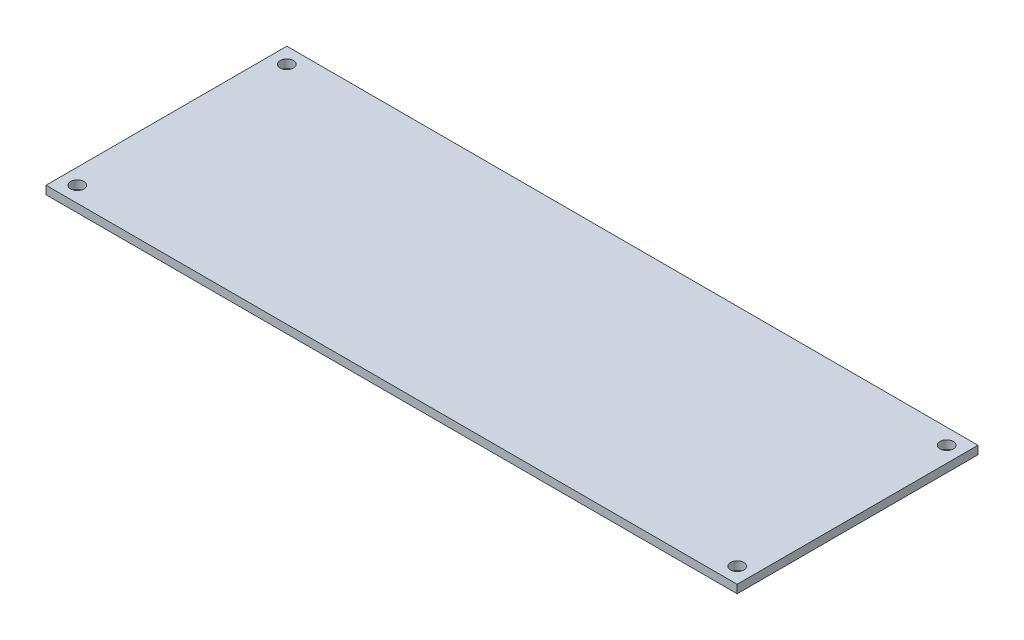
ISO-10303-21;
HEADER;
FILE_DESCRIPTION(('STEP AP214'),'2;1');
FILE_NAME('part.step','',(''),(''),'','','');
FILE_SCHEMA(('AUTOMOTIVE_DESIGN { 1 0 10303 214 1 1 1 1 }'));
ENDSEC;
DATA;
#1=APPLICATION_CONTEXT('core data for automotive mechanical design processes');
#2=APPLICATION_PROTOCOL_DEFINITION('international standard','automotive_design',2000,#1);
#3=PRODUCT_CONTEXT('',#1,'mechanical');
#4=PRODUCT('Part','Part','',(#3));
#5=PRODUCT_RELATED_PRODUCT_CATEGORY('part','',(#4));
#6=PRODUCT_DEFINITION_FORMATION('','',#4);
#7=PRODUCT_DEFINITION_CONTEXT('part definition',#1,'design');
#8=PRODUCT_DEFINITION('design','',#6,#7);
#9=PRODUCT_DEFINITION_SHAPE('','',#8);
#10=(LENGTH_UNIT() NAMED_UNIT(*) SI_UNIT(.MILLI.,.METRE.));
#11=(NAMED_UNIT(*) PLANE_ANGLE_UNIT() SI_UNIT($,.RADIAN.));
#12=(NAMED_UNIT(*) SI_UNIT($,.STERADIAN.) SOLID_ANGLE_UNIT());
#13=UNCERTAINTY_MEASURE_WITH_UNIT(LENGTH_MEASURE(1.E-05),#10,'distance_accuracy_value','');
#14=(GEOMETRIC_REPRESENTATION_CONTEXT(3) GLOBAL_UNCERTAINTY_ASSIGNED_CONTEXT((#13)) GLOBAL_UNIT_ASSIGNED_CONTEXT((#10,
#11,#12)) REPRESENTATION_CONTEXT('',''));
#15=CARTESIAN_POINT('',(0.,0.,0.));
#16=DIRECTION('',(0.,0.,1.));
#17=DIRECTION('',(1.,0.,0.));
#18=AXIS2_PLACEMENT_3D('',#15,#16,#17);
#19=CARTESIAN_POINT('',(-83.8,2.,-29.2));
#20=DIRECTION('',(1.,0.,0.));
#21=DIRECTION('',(0.,0.,-1.));
#22=AXIS2_PLACEMENT_3D('',#19,#20,#21);
#23=PLANE('',#22);
#24=DIRECTION('',(0.,0.,1.));
#25=VECTOR('',#24,1.);
#26=CARTESIAN_POINT('',(-83.8,0.,-29.2));
#27=LINE('',#26,#25);
#28=CARTESIAN_POINT('',(-83.8,0.,-29.2));
#29=VERTEX_POINT('',#28);
#30=CARTESIAN_POINT('',(-83.8,0.,29.2));
#31=VERTEX_POINT('',#30);
#32=EDGE_CURVE('E96',#29,#31,#27,.T.);
#33=ORIENTED_EDGE('',*,*,#32,.T.);
#34=DIRECTION('',(0.,-1.,0.));
#35=VECTOR('',#34,1.);
#36=CARTESIAN_POINT('',(-83.8,2.,29.2));
#37=LINE('',#36,#35);
#38=CARTESIAN_POINT('',(-83.8,2.,29.2));
#39=VERTEX_POINT('',#38);
#40=EDGE_CURVE('E11',#39,#31,#37,.T.);
#41=ORIENTED_EDGE('',*,*,#40,.F.);
#42=DIRECTION('',(0.,0.,1.));
#43=VECTOR('',#42,1.);
#44=CARTESIAN_POINT('',(-83.8,2.,-29.2));
#45=LINE('',#44,#43);
#46=CARTESIAN_POINT('',(-83.8,2.,-29.2));
#47=VERTEX_POINT('',#46);
#48=EDGE_CURVE('E82',#47,#39,#45,.T.);
#49=ORIENTED_EDGE('',*,*,#48,.F.);
#50=DIRECTION('',(0.,-1.,0.));
#51=VECTOR('',#50,1.);
#52=CARTESIAN_POINT('',(-83.8,2.,-29.2));
#53=LINE('',#52,#51);
#54=EDGE_CURVE('E49',#47,#29,#53,.T.);
#55=ORIENTED_EDGE('',*,*,#54,.T.);
#56=EDGE_LOOP('',(#33,#41,#49,#55));
#57=FACE_BOUND('',#56,.T.);
#58=ADVANCED_FACE('F33',(#57),#23,.F.);
#59=CARTESIAN_POINT('',(-83.8,2.,29.2));
#60=DIRECTION('',(0.,0.,-1.));
#61=DIRECTION('',(-1.,0.,0.));
#62=AXIS2_PLACEMENT_3D('',#59,#60,#61);
#63=PLANE('',#62);
#64=DIRECTION('',(1.,0.,0.));
#65=VECTOR('',#64,1.);
#66=CARTESIAN_POINT('',(-83.8,0.,29.2));
#67=LINE('',#66,#65);
#68=CARTESIAN_POINT('',(83.8,0.,29.2));
#69=VERTEX_POINT('',#68);
#70=EDGE_CURVE('E87',#31,#69,#67,.T.);
#71=ORIENTED_EDGE('',*,*,#70,.T.);
#72=DIRECTION('',(0.,-1.,0.));
#73=VECTOR('',#72,1.);
#74=CARTESIAN_POINT('',(83.8,2.,29.2));
#75=LINE('',#74,#73);
#76=CARTESIAN_POINT('',(83.8,2.,29.2));
#77=VERTEX_POINT('',#76);
#78=EDGE_CURVE('E41',#77,#69,#75,.T.);
#79=ORIENTED_EDGE('',*,*,#78,.F.);
#80=DIRECTION('',(1.,0.,0.));
#81=VECTOR('',#80,1.);
#82=CARTESIAN_POINT('',(-83.8,2.,29.2));
#83=LINE('',#82,#81);
#84=EDGE_CURVE('E74',#39,#77,#83,.T.);
#85=ORIENTED_EDGE('',*,*,#84,.F.);
#86=ORIENTED_EDGE('',*,*,#40,.T.);
#87=EDGE_LOOP('',(#71,#79,#85,#86));
#88=FACE_BOUND('',#87,.T.);
#89=ADVANCED_FACE('F86',(#88),#63,.F.);
#90=CARTESIAN_POINT('',(83.8,2.,-29.2));
#91=DIRECTION('',(1.,0.,0.));
#92=DIRECTION('',(0.,0.,-1.));
#93=AXIS2_PLACEMENT_3D('',#90,#91,#92);
#94=PLANE('',#93);
#95=DIRECTION('',(0.,0.,1.));
#96=VECTOR('',#95,1.);
#97=CARTESIAN_POINT('',(83.8,0.,-29.2));
#98=LINE('',#97,#96);
#99=CARTESIAN_POINT('',(83.8,0.,-29.2));
#100=VERTEX_POINT('',#99);
#101=EDGE_CURVE('E100',#100,#69,#98,.T.);
#102=ORIENTED_EDGE('',*,*,#101,.F.);
#103=DIRECTION('',(0.,-1.,0.));
#104=VECTOR('',#103,1.);
#105=CARTESIAN_POINT('',(83.8,2.,-29.2));
#106=LINE('',#105,#104);
#107=CARTESIAN_POINT('',(83.8,2.,-29.2));
#108=VERTEX_POINT('',#107);
#109=EDGE_CURVE('E63',#108,#100,#106,.T.);
#110=ORIENTED_EDGE('',*,*,#109,.F.);
#111=DIRECTION('',(0.,0.,1.));
#112=VECTOR('',#111,1.);
#113=CARTESIAN_POINT('',(83.8,2.,-29.2));
#114=LINE('',#113,#112);
#115=EDGE_CURVE('E81',#108,#77,#114,.T.);
#116=ORIENTED_EDGE('',*,*,#115,.T.);
#117=ORIENTED_EDGE('',*,*,#78,.T.);
#118=EDGE_LOOP('',(#102,#110,#116,#117));
#119=FACE_BOUND('',#118,.T.);
#120=ADVANCED_FACE('F90',(#119),#94,.T.);
#121=CARTESIAN_POINT('',(-83.8,2.,-29.2));
#122=DIRECTION('',(0.,0.,-1.));
#123=DIRECTION('',(-1.,0.,0.));
#124=AXIS2_PLACEMENT_3D('',#121,#122,#123);
#125=PLANE('',#124);
#126=DIRECTION('',(1.,0.,0.));
#127=VECTOR('',#126,1.);
#128=CARTESIAN_POINT('',(-83.8,0.,-29.2));
#129=LINE('',#128,#127);
#130=EDGE_CURVE('E102',#29,#100,#129,.T.);
#131=ORIENTED_EDGE('',*,*,#130,.F.);
#132=ORIENTED_EDGE('',*,*,#54,.F.);
#133=DIRECTION('',(1.,0.,0.));
#134=VECTOR('',#133,1.);
#135=CARTESIAN_POINT('',(-83.8,2.,-29.2));
#136=LINE('',#135,#134);
#137=EDGE_CURVE('E91',#47,#108,#136,.T.);
#138=ORIENTED_EDGE('',*,*,#137,.T.);
#139=ORIENTED_EDGE('',*,*,#109,.T.);
#140=EDGE_LOOP('',(#131,#132,#138,#139));
#141=FACE_BOUND('',#140,.T.);
#142=ADVANCED_FACE('F138',(#141),#125,.T.);
#143=CARTESIAN_POINT('',(0.,2.,0.));
#144=DIRECTION('',(0.,1.,0.));
#145=DIRECTION('',(0.,0.,1.));
#146=AXIS2_PLACEMENT_3D('',#143,#144,#145);
#147=PLANE('',#146);
#148=CARTESIAN_POINT('',(-80.,2.,25.4));
#149=DIRECTION('',(0.,1.,0.));
#150=DIRECTION('',(0.,0.,1.));
#151=AXIS2_PLACEMENT_3D('',#148,#149,#150);
#152=CIRCLE('',#151,1.6);
#153=CARTESIAN_POINT('',(-80.,2.,27.));
#154=VERTEX_POINT('',#153);
#155=EDGE_CURVE('E111',#154,#154,#152,.T.);
#156=ORIENTED_EDGE('',*,*,#155,.F.);
#157=EDGE_LOOP('',(#156));
#158=FACE_BOUND('',#157,.T.);
#159=CARTESIAN_POINT('',(80.,2.,-25.4));
#160=DIRECTION('',(0.,1.,0.));
#161=DIRECTION('',(0.,0.,1.));
#162=AXIS2_PLACEMENT_3D('',#159,#160,#161);
#163=CIRCLE('',#162,1.6);
#164=CARTESIAN_POINT('',(80.,2.,-23.8));
#165=VERTEX_POINT('',#164);
#166=EDGE_CURVE('E117',#165,#165,#163,.T.);
#167=ORIENTED_EDGE('',*,*,#166,.F.);
#168=EDGE_LOOP('',(#167));
#169=FACE_BOUND('',#168,.T.);
#170=CARTESIAN_POINT('',(80.,2.,25.4));
#171=DIRECTION('',(0.,1.,0.));
#172=DIRECTION('',(0.,0.,1.));
#173=AXIS2_PLACEMENT_3D('',#170,#171,#172);
#174=CIRCLE('',#173,1.6);
#175=CARTESIAN_POINT('',(80.,2.,27.));
#176=VERTEX_POINT('',#175);
#177=EDGE_CURVE('E118',#176,#176,#174,.T.);
#178=ORIENTED_EDGE('',*,*,#177,.F.);
#179=EDGE_LOOP('',(#178));
#180=FACE_BOUND('',#179,.T.);
#181=CARTESIAN_POINT('',(-80.,2.,-25.4));
#182=DIRECTION('',(0.,1.,0.));
#183=DIRECTION('',(0.,0.,1.));
#184=AXIS2_PLACEMENT_3D('',#181,#182,#183);
#185=CIRCLE('',#184,1.6);
#186=CARTESIAN_POINT('',(-80.,2.,-23.8));
#187=VERTEX_POINT('',#186);
#188=EDGE_CURVE('E98',#187,#187,#185,.T.);
#189=ORIENTED_EDGE('',*,*,#188,.F.);
#190=EDGE_LOOP('',(#189));
#191=FACE_BOUND('',#190,.T.);
#192=ORIENTED_EDGE('',*,*,#48,.T.);
#193=ORIENTED_EDGE('',*,*,#84,.T.);
#194=ORIENTED_EDGE('',*,*,#115,.F.);
#195=ORIENTED_EDGE('',*,*,#137,.F.);
#196=EDGE_LOOP('',(#192,#193,#194,#195));
#197=FACE_BOUND('',#196,.T.);
#198=ADVANCED_FACE('F78',(#158,#169,#180,#191,#197),#147,.T.);
#199=CARTESIAN_POINT('',(0.,0.,0.));
#200=DIRECTION('',(0.,1.,0.));
#201=DIRECTION('',(0.,0.,1.));
#202=AXIS2_PLACEMENT_3D('',#199,#200,#201);
#203=PLANE('',#202);
#204=CARTESIAN_POINT('',(-80.,0.,25.4));
#205=DIRECTION('',(0.,1.,0.));
#206=DIRECTION('',(0.,0.,1.));
#207=AXIS2_PLACEMENT_3D('',#204,#205,#206);
#208=CIRCLE('',#207,1.6);
#209=CARTESIAN_POINT('',(-80.,0.,27.));
#210=VERTEX_POINT('',#209);
#211=EDGE_CURVE('E121',#210,#210,#208,.T.);
#212=ORIENTED_EDGE('',*,*,#211,.T.);
#213=EDGE_LOOP('',(#212));
#214=FACE_BOUND('',#213,.T.);
#215=CARTESIAN_POINT('',(80.,0.,-25.4));
#216=DIRECTION('',(0.,1.,0.));
#217=DIRECTION('',(0.,0.,1.));
#218=AXIS2_PLACEMENT_3D('',#215,#216,#217);
#219=CIRCLE('',#218,1.6);
#220=CARTESIAN_POINT('',(80.,0.,-23.8));
#221=VERTEX_POINT('',#220);
#222=EDGE_CURVE('E114',#221,#221,#219,.T.);
#223=ORIENTED_EDGE('',*,*,#222,.T.);
#224=EDGE_LOOP('',(#223));
#225=FACE_BOUND('',#224,.T.);
#226=CARTESIAN_POINT('',(80.,0.,25.4));
#227=DIRECTION('',(0.,1.,0.));
#228=DIRECTION('',(0.,0.,1.));
#229=AXIS2_PLACEMENT_3D('',#226,#227,#228);
#230=CIRCLE('',#229,1.6);
#231=CARTESIAN_POINT('',(80.,0.,27.));
#232=VERTEX_POINT('',#231);
#233=EDGE_CURVE('E126',#232,#232,#230,.T.);
#234=ORIENTED_EDGE('',*,*,#233,.T.);
#235=EDGE_LOOP('',(#234));
#236=FACE_BOUND('',#235,.T.);
#237=CARTESIAN_POINT('',(-80.,0.,-25.4));
#238=DIRECTION('',(0.,1.,0.));
#239=DIRECTION('',(0.,0.,1.));
#240=AXIS2_PLACEMENT_3D('',#237,#238,#239);
#241=CIRCLE('',#240,1.6);
#242=CARTESIAN_POINT('',(-80.,0.,-23.8));
#243=VERTEX_POINT('',#242);
#244=EDGE_CURVE('E108',#243,#243,#241,.T.);
#245=ORIENTED_EDGE('',*,*,#244,.T.);
#246=EDGE_LOOP('',(#245));
#247=FACE_BOUND('',#246,.T.);
#248=ORIENTED_EDGE('',*,*,#32,.F.);
#249=ORIENTED_EDGE('',*,*,#130,.T.);
#250=ORIENTED_EDGE('',*,*,#101,.T.);
#251=ORIENTED_EDGE('',*,*,#70,.F.);
#252=EDGE_LOOP('',(#248,#249,#250,#251));
#253=FACE_BOUND('',#252,.T.);
#254=ADVANCED_FACE('F137',(#214,#225,#236,#247,#253),#203,.F.);
#255=CARTESIAN_POINT('',(-80.,2.,-25.4));
#256=DIRECTION('',(0.,-1.,0.));
#257=DIRECTION('',(0.,0.,-1.));
#258=AXIS2_PLACEMENT_3D('',#255,#256,#257);
#259=CYLINDRICAL_SURFACE('',#258,1.6);
#260=ORIENTED_EDGE('',*,*,#188,.T.);
#261=EDGE_LOOP('',(#260));
#262=FACE_BOUND('',#261,.T.);
#263=ORIENTED_EDGE('',*,*,#244,.F.);
#264=EDGE_LOOP('',(#263));
#265=FACE_BOUND('',#264,.T.);
#266=ADVANCED_FACE('F143',(#262,#265),#259,.F.);
#267=CARTESIAN_POINT('',(80.,2.,25.4));
#268=DIRECTION('',(0.,-1.,0.));
#269=DIRECTION('',(0.,0.,-1.));
#270=AXIS2_PLACEMENT_3D('',#267,#268,#269);
#271=CYLINDRICAL_SURFACE('',#270,1.6);
#272=ORIENTED_EDGE('',*,*,#177,.T.);
#273=EDGE_LOOP('',(#272));
#274=FACE_BOUND('',#273,.T.);
#275=ORIENTED_EDGE('',*,*,#233,.F.);
#276=EDGE_LOOP('',(#275));
#277=FACE_BOUND('',#276,.T.);
#278=ADVANCED_FACE('F132',(#274,#277),#271,.F.);
#279=CARTESIAN_POINT('',(80.,2.,-25.4));
#280=DIRECTION('',(0.,-1.,0.));
#281=DIRECTION('',(0.,0.,-1.));
#282=AXIS2_PLACEMENT_3D('',#279,#280,#281);
#283=CYLINDRICAL_SURFACE('',#282,1.6);
#284=ORIENTED_EDGE('',*,*,#166,.T.);
#285=EDGE_LOOP('',(#284));
#286=FACE_BOUND('',#285,.T.);
#287=ORIENTED_EDGE('',*,*,#222,.F.);
#288=EDGE_LOOP('',(#287));
#289=FACE_BOUND('',#288,.T.);
#290=ADVANCED_FACE('F199',(#286,#289),#283,.F.);
#291=CARTESIAN_POINT('',(-80.,2.,25.4));
#292=DIRECTION('',(0.,-1.,0.));
#293=DIRECTION('',(0.,0.,-1.));
#294=AXIS2_PLACEMENT_3D('',#291,#292,#293);
#295=CYLINDRICAL_SURFACE('',#294,1.6);
#296=ORIENTED_EDGE('',*,*,#155,.T.);
#297=EDGE_LOOP('',(#296));
#298=FACE_BOUND('',#297,.T.);
#299=ORIENTED_EDGE('',*,*,#211,.F.);
#300=EDGE_LOOP('',(#299));
#301=FACE_BOUND('',#300,.T.);
#302=ADVANCED_FACE('F208',(#298,#301),#295,.F.);
#303=CLOSED_SHELL('',(#58,#89,#120,#142,#198,#254,#266,#278,#290,#302));
#304=MANIFOLD_SOLID_BREP('B2',#303);
#305=ADVANCED_BREP_SHAPE_REPRESENTATION('',(#18,#304),#14);
#306=SHAPE_DEFINITION_REPRESENTATION(#9,#305);
ENDSEC;
END-ISO-10303-21;
